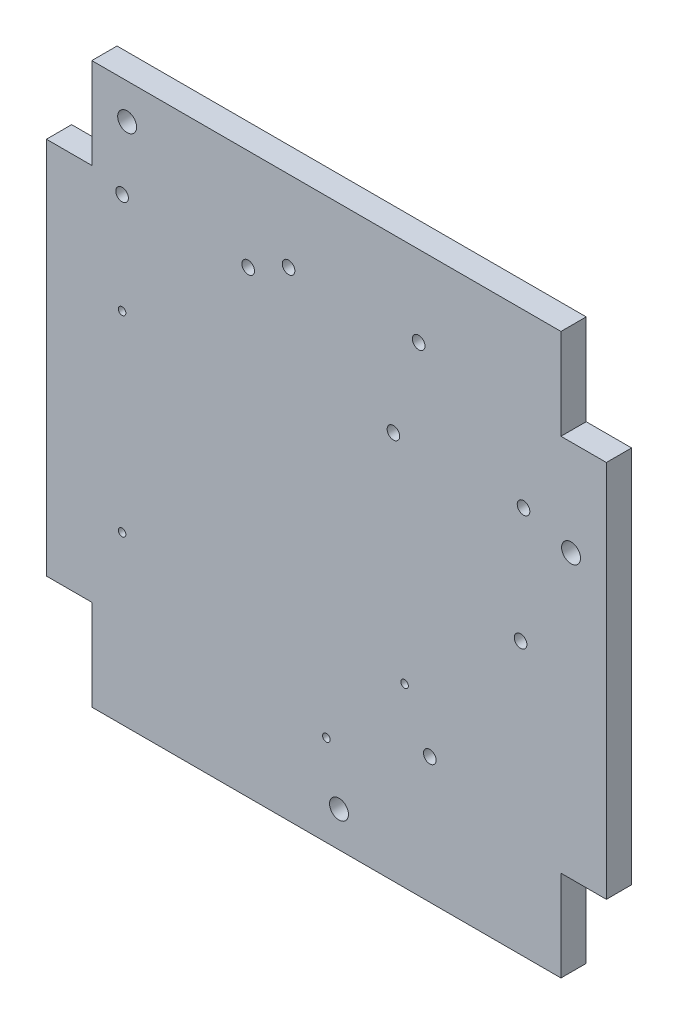
ISO-10303-21;
HEADER;
FILE_DESCRIPTION(('STEP AP214'),'2;1');
FILE_NAME('part.step','',(''),(''),'','','');
FILE_SCHEMA(('AUTOMOTIVE_DESIGN { 1 0 10303 214 1 1 1 1 }'));
ENDSEC;
DATA;
#1=APPLICATION_CONTEXT('core data for automotive mechanical design processes');
#2=APPLICATION_PROTOCOL_DEFINITION('international standard','automotive_design',2000,#1);
#3=PRODUCT_CONTEXT('',#1,'mechanical');
#4=PRODUCT('Part','Part','',(#3));
#5=PRODUCT_RELATED_PRODUCT_CATEGORY('part','',(#4));
#6=PRODUCT_DEFINITION_FORMATION('','',#4);
#7=PRODUCT_DEFINITION_CONTEXT('part definition',#1,'design');
#8=PRODUCT_DEFINITION('design','',#6,#7);
#9=PRODUCT_DEFINITION_SHAPE('','',#8);
#10=(LENGTH_UNIT() NAMED_UNIT(*) SI_UNIT(.MILLI.,.METRE.));
#11=(NAMED_UNIT(*) PLANE_ANGLE_UNIT() SI_UNIT($,.RADIAN.));
#12=(NAMED_UNIT(*) SI_UNIT($,.STERADIAN.) SOLID_ANGLE_UNIT());
#13=UNCERTAINTY_MEASURE_WITH_UNIT(LENGTH_MEASURE(1.E-05),#10,'distance_accuracy_value','');
#14=(GEOMETRIC_REPRESENTATION_CONTEXT(3) GLOBAL_UNCERTAINTY_ASSIGNED_CONTEXT((#13)) GLOBAL_UNIT_ASSIGNED_CONTEXT((#10,
#11,#12)) REPRESENTATION_CONTEXT('',''));
#15=CARTESIAN_POINT('',(0.,0.,0.));
#16=DIRECTION('',(0.,0.,1.));
#17=DIRECTION('',(1.,0.,0.));
#18=AXIS2_PLACEMENT_3D('',#15,#16,#17);
#19=CARTESIAN_POINT('',(0.,18.,5.));
#20=DIRECTION('',(0.,1.,0.));
#21=DIRECTION('',(0.,0.,1.));
#22=AXIS2_PLACEMENT_3D('',#19,#20,#21);
#23=PLANE('',#22);
#24=DIRECTION('',(1.,0.,0.));
#25=VECTOR('',#24,1.);
#26=CARTESIAN_POINT('',(0.,18.,0.));
#27=LINE('',#26,#25);
#28=CARTESIAN_POINT('',(0.,18.,0.));
#29=VERTEX_POINT('',#28);
#30=CARTESIAN_POINT('',(8.99999999999999,18.,0.));
#31=VERTEX_POINT('',#30);
#32=EDGE_CURVE('E209',#29,#31,#27,.T.);
#33=ORIENTED_EDGE('',*,*,#32,.T.);
#34=DIRECTION('',(0.,0.,-1.));
#35=VECTOR('',#34,1.);
#36=CARTESIAN_POINT('',(8.99999999999999,18.,5.));
#37=LINE('',#36,#35);
#38=CARTESIAN_POINT('',(8.99999999999999,18.,5.));
#39=VERTEX_POINT('',#38);
#40=EDGE_CURVE('E11',#39,#31,#37,.T.);
#41=ORIENTED_EDGE('',*,*,#40,.F.);
#42=DIRECTION('',(1.,0.,0.));
#43=VECTOR('',#42,1.);
#44=CARTESIAN_POINT('',(0.,18.,5.));
#45=LINE('',#44,#43);
#46=CARTESIAN_POINT('',(0.,18.,5.));
#47=VERTEX_POINT('',#46);
#48=EDGE_CURVE('E716',#47,#39,#45,.T.);
#49=ORIENTED_EDGE('',*,*,#48,.F.);
#50=DIRECTION('',(0.,0.,-1.));
#51=VECTOR('',#50,1.);
#52=CARTESIAN_POINT('',(0.,18.,5.));
#53=LINE('',#52,#51);
#54=EDGE_CURVE('E60',#47,#29,#53,.T.);
#55=ORIENTED_EDGE('',*,*,#54,.T.);
#56=EDGE_LOOP('',(#33,#41,#49,#55));
#57=FACE_BOUND('',#56,.T.);
#58=ADVANCED_FACE('F43',(#57),#23,.F.);
#59=CARTESIAN_POINT('',(9.,0.,5.));
#60=DIRECTION('',(1.,0.,0.));
#61=DIRECTION('',(0.,1.,0.));
#62=AXIS2_PLACEMENT_3D('',#59,#60,#61);
#63=PLANE('',#62);
#64=DIRECTION('',(0.,-1.,0.));
#65=VECTOR('',#64,1.);
#66=CARTESIAN_POINT('',(9.,0.,0.));
#67=LINE('',#66,#65);
#68=CARTESIAN_POINT('',(9.,0.,0.));
#69=VERTEX_POINT('',#68);
#70=EDGE_CURVE('E211',#31,#69,#67,.T.);
#71=ORIENTED_EDGE('',*,*,#70,.T.);
#72=DIRECTION('',(0.,0.,-1.));
#73=VECTOR('',#72,1.);
#74=CARTESIAN_POINT('',(9.,0.,5.));
#75=LINE('',#74,#73);
#76=CARTESIAN_POINT('',(9.,0.,5.));
#77=VERTEX_POINT('',#76);
#78=EDGE_CURVE('E52',#77,#69,#75,.T.);
#79=ORIENTED_EDGE('',*,*,#78,.F.);
#80=DIRECTION('',(0.,-1.,0.));
#81=VECTOR('',#80,1.);
#82=CARTESIAN_POINT('',(9.,0.,5.));
#83=LINE('',#82,#81);
#84=EDGE_CURVE('E110',#39,#77,#83,.T.);
#85=ORIENTED_EDGE('',*,*,#84,.F.);
#86=ORIENTED_EDGE('',*,*,#40,.T.);
#87=EDGE_LOOP('',(#71,#79,#85,#86));
#88=FACE_BOUND('',#87,.T.);
#89=ADVANCED_FACE('F304',(#88),#63,.F.);
#90=CARTESIAN_POINT('',(0.,0.,5.));
#91=DIRECTION('',(0.,1.,0.));
#92=DIRECTION('',(-1.,0.,0.));
#93=AXIS2_PLACEMENT_3D('',#90,#91,#92);
#94=PLANE('',#93);
#95=DIRECTION('',(1.,0.,0.));
#96=VECTOR('',#95,1.);
#97=CARTESIAN_POINT('',(0.,0.,0.));
#98=LINE('',#97,#96);
#99=CARTESIAN_POINT('',(102.,0.,0.));
#100=VERTEX_POINT('',#99);
#101=EDGE_CURVE('E213',#69,#100,#98,.T.);
#102=ORIENTED_EDGE('',*,*,#101,.T.);
#103=DIRECTION('',(0.,0.,-1.));
#104=VECTOR('',#103,1.);
#105=CARTESIAN_POINT('',(102.,0.,5.));
#106=LINE('',#105,#104);
#107=CARTESIAN_POINT('',(102.,0.,5.));
#108=VERTEX_POINT('',#107);
#109=EDGE_CURVE('E254',#108,#100,#106,.T.);
#110=ORIENTED_EDGE('',*,*,#109,.F.);
#111=DIRECTION('',(1.,0.,0.));
#112=VECTOR('',#111,1.);
#113=CARTESIAN_POINT('',(0.,0.,5.));
#114=LINE('',#113,#112);
#115=EDGE_CURVE('E261',#77,#108,#114,.T.);
#116=ORIENTED_EDGE('',*,*,#115,.F.);
#117=ORIENTED_EDGE('',*,*,#78,.T.);
#118=EDGE_LOOP('',(#102,#110,#116,#117));
#119=FACE_BOUND('',#118,.T.);
#120=ADVANCED_FACE('F259',(#119),#94,.F.);
#121=CARTESIAN_POINT('',(102.,-1.5728159515523E-13,5.));
#122=DIRECTION('',(1.,0.,0.));
#123=DIRECTION('',(0.,1.,0.));
#124=AXIS2_PLACEMENT_3D('',#121,#122,#123);
#125=PLANE('',#124);
#126=DIRECTION('',(0.,-1.,0.));
#127=VECTOR('',#126,1.);
#128=CARTESIAN_POINT('',(102.,-1.5728159515523E-13,0.));
#129=LINE('',#128,#127);
#130=CARTESIAN_POINT('',(102.,18.,0.));
#131=VERTEX_POINT('',#130);
#132=EDGE_CURVE('E216',#131,#100,#129,.T.);
#133=ORIENTED_EDGE('',*,*,#132,.F.);
#134=DIRECTION('',(0.,0.,-1.));
#135=VECTOR('',#134,1.);
#136=CARTESIAN_POINT('',(102.,18.,5.));
#137=LINE('',#136,#135);
#138=CARTESIAN_POINT('',(102.,18.,5.));
#139=VERTEX_POINT('',#138);
#140=EDGE_CURVE('E252',#139,#131,#137,.T.);
#141=ORIENTED_EDGE('',*,*,#140,.F.);
#142=DIRECTION('',(0.,-1.,0.));
#143=VECTOR('',#142,1.);
#144=CARTESIAN_POINT('',(102.,-1.5728159515523E-13,5.));
#145=LINE('',#144,#143);
#146=EDGE_CURVE('E272',#139,#108,#145,.T.);
#147=ORIENTED_EDGE('',*,*,#146,.T.);
#148=ORIENTED_EDGE('',*,*,#109,.T.);
#149=EDGE_LOOP('',(#133,#141,#147,#148));
#150=FACE_BOUND('',#149,.T.);
#151=ADVANCED_FACE('F268',(#150),#125,.T.);
#152=CARTESIAN_POINT('',(0.,18.,5.));
#153=DIRECTION('',(0.,1.,0.));
#154=DIRECTION('',(0.,0.,1.));
#155=AXIS2_PLACEMENT_3D('',#152,#153,#154);
#156=PLANE('',#155);
#157=DIRECTION('',(1.,0.,0.));
#158=VECTOR('',#157,1.);
#159=CARTESIAN_POINT('',(0.,18.,0.));
#160=LINE('',#159,#158);
#161=CARTESIAN_POINT('',(111.,18.,0.));
#162=VERTEX_POINT('',#161);
#163=EDGE_CURVE('E219',#131,#162,#160,.T.);
#164=ORIENTED_EDGE('',*,*,#163,.T.);
#165=DIRECTION('',(0.,0.,-1.));
#166=VECTOR('',#165,1.);
#167=CARTESIAN_POINT('',(111.,18.,5.));
#168=LINE('',#167,#166);
#169=CARTESIAN_POINT('',(111.,18.,5.));
#170=VERTEX_POINT('',#169);
#171=EDGE_CURVE('E249',#170,#162,#168,.T.);
#172=ORIENTED_EDGE('',*,*,#171,.F.);
#173=DIRECTION('',(1.,0.,0.));
#174=VECTOR('',#173,1.);
#175=CARTESIAN_POINT('',(0.,18.,5.));
#176=LINE('',#175,#174);
#177=EDGE_CURVE('E273',#139,#170,#176,.T.);
#178=ORIENTED_EDGE('',*,*,#177,.F.);
#179=ORIENTED_EDGE('',*,*,#140,.T.);
#180=EDGE_LOOP('',(#164,#172,#178,#179));
#181=FACE_BOUND('',#180,.T.);
#182=ADVANCED_FACE('F589',(#181),#156,.F.);
#183=CARTESIAN_POINT('',(111.,0.,5.));
#184=DIRECTION('',(-1.,0.,0.));
#185=DIRECTION('',(0.,-1.,0.));
#186=AXIS2_PLACEMENT_3D('',#183,#184,#185);
#187=PLANE('',#186);
#188=DIRECTION('',(0.,1.,0.));
#189=VECTOR('',#188,1.);
#190=CARTESIAN_POINT('',(111.,0.,0.));
#191=LINE('',#190,#189);
#192=CARTESIAN_POINT('',(111.,93.,0.));
#193=VERTEX_POINT('',#192);
#194=EDGE_CURVE('E221',#162,#193,#191,.T.);
#195=ORIENTED_EDGE('',*,*,#194,.T.);
#196=DIRECTION('',(0.,0.,-1.));
#197=VECTOR('',#196,1.);
#198=CARTESIAN_POINT('',(111.,93.,5.));
#199=LINE('',#198,#197);
#200=CARTESIAN_POINT('',(111.,93.,5.));
#201=VERTEX_POINT('',#200);
#202=EDGE_CURVE('E247',#201,#193,#199,.T.);
#203=ORIENTED_EDGE('',*,*,#202,.F.);
#204=DIRECTION('',(0.,1.,0.));
#205=VECTOR('',#204,1.);
#206=CARTESIAN_POINT('',(111.,0.,5.));
#207=LINE('',#206,#205);
#208=EDGE_CURVE('E275',#170,#201,#207,.T.);
#209=ORIENTED_EDGE('',*,*,#208,.F.);
#210=ORIENTED_EDGE('',*,*,#171,.T.);
#211=EDGE_LOOP('',(#195,#203,#209,#210));
#212=FACE_BOUND('',#211,.T.);
#213=ADVANCED_FACE('F578',(#212),#187,.F.);
#214=CARTESIAN_POINT('',(0.,93.,5.));
#215=DIRECTION('',(0.,1.,0.));
#216=DIRECTION('',(0.,0.,1.));
#217=AXIS2_PLACEMENT_3D('',#214,#215,#216);
#218=PLANE('',#217);
#219=DIRECTION('',(1.,0.,0.));
#220=VECTOR('',#219,1.);
#221=CARTESIAN_POINT('',(0.,93.,0.));
#222=LINE('',#221,#220);
#223=CARTESIAN_POINT('',(102.,93.,0.));
#224=VERTEX_POINT('',#223);
#225=EDGE_CURVE('E224',#224,#193,#222,.T.);
#226=ORIENTED_EDGE('',*,*,#225,.F.);
#227=DIRECTION('',(0.,0.,-1.));
#228=VECTOR('',#227,1.);
#229=CARTESIAN_POINT('',(102.,93.,5.));
#230=LINE('',#229,#228);
#231=CARTESIAN_POINT('',(102.,93.,5.));
#232=VERTEX_POINT('',#231);
#233=EDGE_CURVE('E245',#232,#224,#230,.T.);
#234=ORIENTED_EDGE('',*,*,#233,.F.);
#235=DIRECTION('',(1.,0.,0.));
#236=VECTOR('',#235,1.);
#237=CARTESIAN_POINT('',(0.,93.,5.));
#238=LINE('',#237,#236);
#239=EDGE_CURVE('E281',#232,#201,#238,.T.);
#240=ORIENTED_EDGE('',*,*,#239,.T.);
#241=ORIENTED_EDGE('',*,*,#202,.T.);
#242=EDGE_LOOP('',(#226,#234,#240,#241));
#243=FACE_BOUND('',#242,.T.);
#244=ADVANCED_FACE('F567',(#243),#218,.T.);
#245=CARTESIAN_POINT('',(102.,0.,5.));
#246=DIRECTION('',(-1.,0.,0.));
#247=DIRECTION('',(0.,-1.,0.));
#248=AXIS2_PLACEMENT_3D('',#245,#246,#247);
#249=PLANE('',#248);
#250=DIRECTION('',(0.,1.,0.));
#251=VECTOR('',#250,1.);
#252=CARTESIAN_POINT('',(102.,0.,0.));
#253=LINE('',#252,#251);
#254=CARTESIAN_POINT('',(102.,111.,0.));
#255=VERTEX_POINT('',#254);
#256=EDGE_CURVE('E227',#224,#255,#253,.T.);
#257=ORIENTED_EDGE('',*,*,#256,.T.);
#258=DIRECTION('',(0.,0.,-1.));
#259=VECTOR('',#258,1.);
#260=CARTESIAN_POINT('',(102.,111.,5.));
#261=LINE('',#260,#259);
#262=CARTESIAN_POINT('',(102.,111.,5.));
#263=VERTEX_POINT('',#262);
#264=EDGE_CURVE('E243',#263,#255,#261,.T.);
#265=ORIENTED_EDGE('',*,*,#264,.F.);
#266=DIRECTION('',(0.,1.,0.));
#267=VECTOR('',#266,1.);
#268=CARTESIAN_POINT('',(102.,0.,5.));
#269=LINE('',#268,#267);
#270=EDGE_CURVE('E284',#232,#263,#269,.T.);
#271=ORIENTED_EDGE('',*,*,#270,.F.);
#272=ORIENTED_EDGE('',*,*,#233,.T.);
#273=EDGE_LOOP('',(#257,#265,#271,#272));
#274=FACE_BOUND('',#273,.T.);
#275=ADVANCED_FACE('F557',(#274),#249,.F.);
#276=CARTESIAN_POINT('',(0.,111.,5.));
#277=DIRECTION('',(0.,1.,0.));
#278=DIRECTION('',(0.,0.,1.));
#279=AXIS2_PLACEMENT_3D('',#276,#277,#278);
#280=PLANE('',#279);
#281=DIRECTION('',(1.,0.,0.));
#282=VECTOR('',#281,1.);
#283=CARTESIAN_POINT('',(0.,111.,0.));
#284=LINE('',#283,#282);
#285=CARTESIAN_POINT('',(8.99999999999997,111.,0.));
#286=VERTEX_POINT('',#285);
#287=EDGE_CURVE('E230',#286,#255,#284,.T.);
#288=ORIENTED_EDGE('',*,*,#287,.F.);
#289=DIRECTION('',(0.,0.,-1.));
#290=VECTOR('',#289,1.);
#291=CARTESIAN_POINT('',(8.99999999999997,111.,5.));
#292=LINE('',#291,#290);
#293=CARTESIAN_POINT('',(8.99999999999997,111.,5.));
#294=VERTEX_POINT('',#293);
#295=EDGE_CURVE('E147',#294,#286,#292,.T.);
#296=ORIENTED_EDGE('',*,*,#295,.F.);
#297=DIRECTION('',(1.,0.,0.));
#298=VECTOR('',#297,1.);
#299=CARTESIAN_POINT('',(0.,111.,5.));
#300=LINE('',#299,#298);
#301=EDGE_CURVE('E156',#294,#263,#300,.T.);
#302=ORIENTED_EDGE('',*,*,#301,.T.);
#303=ORIENTED_EDGE('',*,*,#264,.T.);
#304=EDGE_LOOP('',(#288,#296,#302,#303));
#305=FACE_BOUND('',#304,.T.);
#306=ADVANCED_FACE('F287',(#305),#280,.T.);
#307=CARTESIAN_POINT('',(8.99999999999999,0.,5.));
#308=DIRECTION('',(-1.,0.,0.));
#309=DIRECTION('',(0.,-1.,0.));
#310=AXIS2_PLACEMENT_3D('',#307,#308,#309);
#311=PLANE('',#310);
#312=DIRECTION('',(0.,1.,0.));
#313=VECTOR('',#312,1.);
#314=CARTESIAN_POINT('',(8.99999999999999,0.,0.));
#315=LINE('',#314,#313);
#316=CARTESIAN_POINT('',(8.99999999999998,93.,0.));
#317=VERTEX_POINT('',#316);
#318=EDGE_CURVE('E143',#317,#286,#315,.T.);
#319=ORIENTED_EDGE('',*,*,#318,.F.);
#320=DIRECTION('',(0.,0.,-1.));
#321=VECTOR('',#320,1.);
#322=CARTESIAN_POINT('',(8.99999999999998,93.,5.));
#323=LINE('',#322,#321);
#324=CARTESIAN_POINT('',(8.99999999999998,93.,5.));
#325=VERTEX_POINT('',#324);
#326=EDGE_CURVE('E138',#325,#317,#323,.T.);
#327=ORIENTED_EDGE('',*,*,#326,.F.);
#328=DIRECTION('',(0.,1.,0.));
#329=VECTOR('',#328,1.);
#330=CARTESIAN_POINT('',(8.99999999999999,0.,5.));
#331=LINE('',#330,#329);
#332=EDGE_CURVE('E141',#325,#294,#331,.T.);
#333=ORIENTED_EDGE('',*,*,#332,.T.);
#334=ORIENTED_EDGE('',*,*,#295,.T.);
#335=EDGE_LOOP('',(#319,#327,#333,#334));
#336=FACE_BOUND('',#335,.T.);
#337=ADVANCED_FACE('F140',(#336),#311,.T.);
#338=CARTESIAN_POINT('',(0.,93.,5.));
#339=DIRECTION('',(0.,1.,0.));
#340=DIRECTION('',(0.,0.,1.));
#341=AXIS2_PLACEMENT_3D('',#338,#339,#340);
#342=PLANE('',#341);
#343=DIRECTION('',(1.,0.,0.));
#344=VECTOR('',#343,1.);
#345=CARTESIAN_POINT('',(0.,93.,0.));
#346=LINE('',#345,#344);
#347=CARTESIAN_POINT('',(0.,93.,0.));
#348=VERTEX_POINT('',#347);
#349=EDGE_CURVE('E234',#348,#317,#346,.T.);
#350=ORIENTED_EDGE('',*,*,#349,.F.);
#351=DIRECTION('',(0.,0.,-1.));
#352=VECTOR('',#351,1.);
#353=CARTESIAN_POINT('',(0.,93.,5.));
#354=LINE('',#353,#352);
#355=CARTESIAN_POINT('',(0.,93.,5.));
#356=VERTEX_POINT('',#355);
#357=EDGE_CURVE('E98',#356,#348,#354,.T.);
#358=ORIENTED_EDGE('',*,*,#357,.F.);
#359=DIRECTION('',(1.,0.,0.));
#360=VECTOR('',#359,1.);
#361=CARTESIAN_POINT('',(0.,93.,5.));
#362=LINE('',#361,#360);
#363=EDGE_CURVE('E154',#356,#325,#362,.T.);
#364=ORIENTED_EDGE('',*,*,#363,.T.);
#365=ORIENTED_EDGE('',*,*,#326,.T.);
#366=EDGE_LOOP('',(#350,#358,#364,#365));
#367=FACE_BOUND('',#366,.T.);
#368=ADVANCED_FACE('F158',(#367),#342,.T.);
#369=CARTESIAN_POINT('',(15.,91.,5.));
#370=DIRECTION('',(0.,0.,-1.));
#371=DIRECTION('',(-1.,0.,0.));
#372=AXIS2_PLACEMENT_3D('',#369,#370,#371);
#373=CYLINDRICAL_SURFACE('',#372,1.25);
#374=CARTESIAN_POINT('',(15.,91.,5.));
#375=DIRECTION('',(0.,0.,1.));
#376=DIRECTION('',(1.,0.,0.));
#377=AXIS2_PLACEMENT_3D('',#374,#375,#376);
#378=CIRCLE('',#377,1.25);
#379=CARTESIAN_POINT('',(16.25,91.,5.));
#380=VERTEX_POINT('',#379);
#381=EDGE_CURVE('E713',#380,#380,#378,.T.);
#382=ORIENTED_EDGE('',*,*,#381,.T.);
#383=EDGE_LOOP('',(#382));
#384=FACE_BOUND('',#383,.T.);
#385=CARTESIAN_POINT('',(15.,91.,0.));
#386=DIRECTION('',(0.,0.,1.));
#387=DIRECTION('',(1.,0.,0.));
#388=AXIS2_PLACEMENT_3D('',#385,#386,#387);
#389=CIRCLE('',#388,1.25);
#390=CARTESIAN_POINT('',(16.25,91.,0.));
#391=VERTEX_POINT('',#390);
#392=EDGE_CURVE('E206',#391,#391,#389,.T.);
#393=ORIENTED_EDGE('',*,*,#392,.F.);
#394=EDGE_LOOP('',(#393));
#395=FACE_BOUND('',#394,.T.);
#396=ADVANCED_FACE('F312',(#384,#395),#373,.F.);
#397=CARTESIAN_POINT('',(40.,91.,5.));
#398=DIRECTION('',(0.,0.,-1.));
#399=DIRECTION('',(-1.,0.,0.));
#400=AXIS2_PLACEMENT_3D('',#397,#398,#399);
#401=CYLINDRICAL_SURFACE('',#400,1.25);
#402=CARTESIAN_POINT('',(40.,91.,5.));
#403=DIRECTION('',(0.,0.,1.));
#404=DIRECTION('',(1.,0.,0.));
#405=AXIS2_PLACEMENT_3D('',#402,#403,#404);
#406=CIRCLE('',#405,1.25);
#407=CARTESIAN_POINT('',(41.25,91.,5.));
#408=VERTEX_POINT('',#407);
#409=EDGE_CURVE('E710',#408,#408,#406,.T.);
#410=ORIENTED_EDGE('',*,*,#409,.T.);
#411=EDGE_LOOP('',(#410));
#412=FACE_BOUND('',#411,.T.);
#413=CARTESIAN_POINT('',(40.,91.,0.));
#414=DIRECTION('',(0.,0.,1.));
#415=DIRECTION('',(1.,0.,0.));
#416=AXIS2_PLACEMENT_3D('',#413,#414,#415);
#417=CIRCLE('',#416,1.25);
#418=CARTESIAN_POINT('',(41.25,91.,0.));
#419=VERTEX_POINT('',#418);
#420=EDGE_CURVE('E203',#419,#419,#417,.T.);
#421=ORIENTED_EDGE('',*,*,#420,.F.);
#422=EDGE_LOOP('',(#421));
#423=FACE_BOUND('',#422,.T.);
#424=ADVANCED_FACE('F315',(#412,#423),#401,.F.);
#425=CARTESIAN_POINT('',(48.,95.,5.));
#426=DIRECTION('',(0.,0.,-1.));
#427=DIRECTION('',(-1.,0.,0.));
#428=AXIS2_PLACEMENT_3D('',#425,#426,#427);
#429=CYLINDRICAL_SURFACE('',#428,1.25);
#430=CARTESIAN_POINT('',(48.,95.,5.));
#431=DIRECTION('',(0.,0.,1.));
#432=DIRECTION('',(1.,0.,0.));
#433=AXIS2_PLACEMENT_3D('',#430,#431,#432);
#434=CIRCLE('',#433,1.25);
#435=CARTESIAN_POINT('',(49.25,95.,5.));
#436=VERTEX_POINT('',#435);
#437=EDGE_CURVE('E707',#436,#436,#434,.T.);
#438=ORIENTED_EDGE('',*,*,#437,.T.);
#439=EDGE_LOOP('',(#438));
#440=FACE_BOUND('',#439,.T.);
#441=CARTESIAN_POINT('',(48.,95.,0.));
#442=DIRECTION('',(0.,0.,1.));
#443=DIRECTION('',(1.,0.,0.));
#444=AXIS2_PLACEMENT_3D('',#441,#442,#443);
#445=CIRCLE('',#444,1.25);
#446=CARTESIAN_POINT('',(49.25,95.,0.));
#447=VERTEX_POINT('',#446);
#448=EDGE_CURVE('E200',#447,#447,#445,.T.);
#449=ORIENTED_EDGE('',*,*,#448,.F.);
#450=EDGE_LOOP('',(#449));
#451=FACE_BOUND('',#450,.T.);
#452=ADVANCED_FACE('F319',(#440,#451),#429,.F.);
#453=CARTESIAN_POINT('',(68.7906228862918,77.,5.));
#454=DIRECTION('',(0.,0.,-1.));
#455=DIRECTION('',(-1.,0.,0.));
#456=AXIS2_PLACEMENT_3D('',#453,#454,#455);
#457=CYLINDRICAL_SURFACE('',#456,1.25);
#458=CARTESIAN_POINT('',(68.7906228862918,77.,5.));
#459=DIRECTION('',(0.,0.,1.));
#460=DIRECTION('',(1.,0.,0.));
#461=AXIS2_PLACEMENT_3D('',#458,#459,#460);
#462=CIRCLE('',#461,1.25);
#463=CARTESIAN_POINT('',(70.0406228862918,77.,5.));
#464=VERTEX_POINT('',#463);
#465=EDGE_CURVE('E704',#464,#464,#462,.T.);
#466=ORIENTED_EDGE('',*,*,#465,.T.);
#467=EDGE_LOOP('',(#466));
#468=FACE_BOUND('',#467,.T.);
#469=CARTESIAN_POINT('',(68.7906228862918,77.,0.));
#470=DIRECTION('',(0.,0.,1.));
#471=DIRECTION('',(1.,0.,0.));
#472=AXIS2_PLACEMENT_3D('',#469,#470,#471);
#473=CIRCLE('',#472,1.25);
#474=CARTESIAN_POINT('',(70.0406228862918,77.,0.));
#475=VERTEX_POINT('',#474);
#476=EDGE_CURVE('E197',#475,#475,#473,.T.);
#477=ORIENTED_EDGE('',*,*,#476,.F.);
#478=EDGE_LOOP('',(#477));
#479=FACE_BOUND('',#478,.T.);
#480=ADVANCED_FACE('F323',(#468,#479),#457,.F.);
#481=CARTESIAN_POINT('',(73.7906228862918,95.,5.));
#482=DIRECTION('',(0.,0.,-1.));
#483=DIRECTION('',(-1.,0.,0.));
#484=AXIS2_PLACEMENT_3D('',#481,#482,#483);
#485=CYLINDRICAL_SURFACE('',#484,1.25);
#486=CARTESIAN_POINT('',(73.7906228862918,95.,5.));
#487=DIRECTION('',(0.,0.,1.));
#488=DIRECTION('',(1.,0.,0.));
#489=AXIS2_PLACEMENT_3D('',#486,#487,#488);
#490=CIRCLE('',#489,1.25);
#491=CARTESIAN_POINT('',(75.0406228862918,95.,5.));
#492=VERTEX_POINT('',#491);
#493=EDGE_CURVE('E701',#492,#492,#490,.T.);
#494=ORIENTED_EDGE('',*,*,#493,.T.);
#495=EDGE_LOOP('',(#494));
#496=FACE_BOUND('',#495,.T.);
#497=CARTESIAN_POINT('',(73.7906228862918,95.,0.));
#498=DIRECTION('',(0.,0.,1.));
#499=DIRECTION('',(1.,0.,0.));
#500=AXIS2_PLACEMENT_3D('',#497,#498,#499);
#501=CIRCLE('',#500,1.25);
#502=CARTESIAN_POINT('',(75.0406228862918,95.,0.));
#503=VERTEX_POINT('',#502);
#504=EDGE_CURVE('E194',#503,#503,#501,.T.);
#505=ORIENTED_EDGE('',*,*,#504,.F.);
#506=EDGE_LOOP('',(#505));
#507=FACE_BOUND('',#506,.T.);
#508=ADVANCED_FACE('F327',(#496,#507),#485,.F.);
#509=CARTESIAN_POINT('',(94.5812457725836,77.,5.));
#510=DIRECTION('',(0.,0.,-1.));
#511=DIRECTION('',(-1.,0.,0.));
#512=AXIS2_PLACEMENT_3D('',#509,#510,#511);
#513=CYLINDRICAL_SURFACE('',#512,1.25);
#514=CARTESIAN_POINT('',(94.5812457725836,77.,5.));
#515=DIRECTION('',(0.,0.,1.));
#516=DIRECTION('',(1.,0.,0.));
#517=AXIS2_PLACEMENT_3D('',#514,#515,#516);
#518=CIRCLE('',#517,1.25);
#519=CARTESIAN_POINT('',(95.8312457725836,77.,5.));
#520=VERTEX_POINT('',#519);
#521=EDGE_CURVE('E698',#520,#520,#518,.T.);
#522=ORIENTED_EDGE('',*,*,#521,.T.);
#523=EDGE_LOOP('',(#522));
#524=FACE_BOUND('',#523,.T.);
#525=CARTESIAN_POINT('',(94.5812457725836,77.,0.));
#526=DIRECTION('',(0.,0.,1.));
#527=DIRECTION('',(1.,0.,0.));
#528=AXIS2_PLACEMENT_3D('',#525,#526,#527);
#529=CIRCLE('',#528,1.25);
#530=CARTESIAN_POINT('',(95.8312457725836,77.,0.));
#531=VERTEX_POINT('',#530);
#532=EDGE_CURVE('E191',#531,#531,#529,.T.);
#533=ORIENTED_EDGE('',*,*,#532,.F.);
#534=EDGE_LOOP('',(#533));
#535=FACE_BOUND('',#534,.T.);
#536=ADVANCED_FACE('F331',(#524,#535),#513,.F.);
#537=CARTESIAN_POINT('',(15.,71.,5.));
#538=DIRECTION('',(0.,0.,-1.));
#539=DIRECTION('',(-1.,0.,0.));
#540=AXIS2_PLACEMENT_3D('',#537,#538,#539);
#541=CYLINDRICAL_SURFACE('',#540,0.750000000000002);
#542=CARTESIAN_POINT('',(15.,71.,5.));
#543=DIRECTION('',(0.,0.,1.));
#544=DIRECTION('',(1.,0.,0.));
#545=AXIS2_PLACEMENT_3D('',#542,#543,#544);
#546=CIRCLE('',#545,0.750000000000002);
#547=CARTESIAN_POINT('',(15.75,71.,5.));
#548=VERTEX_POINT('',#547);
#549=EDGE_CURVE('E695',#548,#548,#546,.T.);
#550=ORIENTED_EDGE('',*,*,#549,.T.);
#551=EDGE_LOOP('',(#550));
#552=FACE_BOUND('',#551,.T.);
#553=CARTESIAN_POINT('',(15.,71.,0.));
#554=DIRECTION('',(0.,0.,1.));
#555=DIRECTION('',(1.,0.,0.));
#556=AXIS2_PLACEMENT_3D('',#553,#554,#555);
#557=CIRCLE('',#556,0.750000000000002);
#558=CARTESIAN_POINT('',(15.75,71.,0.));
#559=VERTEX_POINT('',#558);
#560=EDGE_CURVE('E188',#559,#559,#557,.T.);
#561=ORIENTED_EDGE('',*,*,#560,.F.);
#562=EDGE_LOOP('',(#561));
#563=FACE_BOUND('',#562,.T.);
#564=ADVANCED_FACE('F335',(#552,#563),#541,.F.);
#565=CARTESIAN_POINT('',(71.,35.,5.));
#566=DIRECTION('',(0.,0.,-1.));
#567=DIRECTION('',(-1.,0.,0.));
#568=AXIS2_PLACEMENT_3D('',#565,#566,#567);
#569=CYLINDRICAL_SURFACE('',#568,0.749999999999999);
#570=CARTESIAN_POINT('',(71.,35.,5.));
#571=DIRECTION('',(0.,0.,1.));
#572=DIRECTION('',(1.,0.,0.));
#573=AXIS2_PLACEMENT_3D('',#570,#571,#572);
#574=CIRCLE('',#573,0.749999999999999);
#575=CARTESIAN_POINT('',(71.75,35.,5.));
#576=VERTEX_POINT('',#575);
#577=EDGE_CURVE('E692',#576,#576,#574,.T.);
#578=ORIENTED_EDGE('',*,*,#577,.T.);
#579=EDGE_LOOP('',(#578));
#580=FACE_BOUND('',#579,.T.);
#581=CARTESIAN_POINT('',(71.,35.,0.));
#582=DIRECTION('',(0.,0.,1.));
#583=DIRECTION('',(1.,0.,0.));
#584=AXIS2_PLACEMENT_3D('',#581,#582,#583);
#585=CIRCLE('',#584,0.749999999999999);
#586=CARTESIAN_POINT('',(71.75,35.,0.));
#587=VERTEX_POINT('',#586);
#588=EDGE_CURVE('E185',#587,#587,#585,.T.);
#589=ORIENTED_EDGE('',*,*,#588,.F.);
#590=EDGE_LOOP('',(#589));
#591=FACE_BOUND('',#590,.T.);
#592=ADVANCED_FACE('F339',(#580,#591),#569,.F.);
#593=CARTESIAN_POINT('',(15.,33.,5.));
#594=DIRECTION('',(0.,0.,-1.));
#595=DIRECTION('',(-1.,0.,0.));
#596=AXIS2_PLACEMENT_3D('',#593,#594,#595);
#597=CYLINDRICAL_SURFACE('',#596,0.750000000000002);
#598=CARTESIAN_POINT('',(15.,33.,5.));
#599=DIRECTION('',(0.,0.,1.));
#600=DIRECTION('',(1.,0.,0.));
#601=AXIS2_PLACEMENT_3D('',#598,#599,#600);
#602=CIRCLE('',#601,0.750000000000002);
#603=CARTESIAN_POINT('',(15.75,33.,5.));
#604=VERTEX_POINT('',#603);
#605=EDGE_CURVE('E689',#604,#604,#602,.T.);
#606=ORIENTED_EDGE('',*,*,#605,.T.);
#607=EDGE_LOOP('',(#606));
#608=FACE_BOUND('',#607,.T.);
#609=CARTESIAN_POINT('',(15.,33.,0.));
#610=DIRECTION('',(0.,0.,1.));
#611=DIRECTION('',(1.,0.,0.));
#612=AXIS2_PLACEMENT_3D('',#609,#610,#611);
#613=CIRCLE('',#612,0.750000000000002);
#614=CARTESIAN_POINT('',(15.75,33.,0.));
#615=VERTEX_POINT('',#614);
#616=EDGE_CURVE('E182',#615,#615,#613,.T.);
#617=ORIENTED_EDGE('',*,*,#616,.F.);
#618=EDGE_LOOP('',(#617));
#619=FACE_BOUND('',#618,.T.);
#620=ADVANCED_FACE('F343',(#608,#619),#597,.F.);
#621=CARTESIAN_POINT('',(55.5,18.,5.));
#622=DIRECTION('',(0.,0.,-1.));
#623=DIRECTION('',(-1.,0.,0.));
#624=AXIS2_PLACEMENT_3D('',#621,#622,#623);
#625=CYLINDRICAL_SURFACE('',#624,0.749999999999999);
#626=CARTESIAN_POINT('',(55.5,18.,5.));
#627=DIRECTION('',(0.,0.,1.));
#628=DIRECTION('',(1.,0.,0.));
#629=AXIS2_PLACEMENT_3D('',#626,#627,#628);
#630=CIRCLE('',#629,0.749999999999999);
#631=CARTESIAN_POINT('',(56.25,18.,5.));
#632=VERTEX_POINT('',#631);
#633=EDGE_CURVE('E686',#632,#632,#630,.T.);
#634=ORIENTED_EDGE('',*,*,#633,.T.);
#635=EDGE_LOOP('',(#634));
#636=FACE_BOUND('',#635,.T.);
#637=CARTESIAN_POINT('',(55.5,18.,0.));
#638=DIRECTION('',(0.,0.,1.));
#639=DIRECTION('',(1.,0.,0.));
#640=AXIS2_PLACEMENT_3D('',#637,#638,#639);
#641=CIRCLE('',#640,0.749999999999999);
#642=CARTESIAN_POINT('',(56.25,18.,0.));
#643=VERTEX_POINT('',#642);
#644=EDGE_CURVE('E179',#643,#643,#641,.T.);
#645=ORIENTED_EDGE('',*,*,#644,.F.);
#646=EDGE_LOOP('',(#645));
#647=FACE_BOUND('',#646,.T.);
#648=ADVANCED_FACE('F347',(#636,#647),#625,.F.);
#649=CARTESIAN_POINT('',(76.,25.,5.));
#650=DIRECTION('',(0.,0.,-1.));
#651=DIRECTION('',(-1.,0.,0.));
#652=AXIS2_PLACEMENT_3D('',#649,#650,#651);
#653=CYLINDRICAL_SURFACE('',#652,1.25);
#654=CARTESIAN_POINT('',(76.,25.,5.));
#655=DIRECTION('',(0.,0.,1.));
#656=DIRECTION('',(1.,0.,0.));
#657=AXIS2_PLACEMENT_3D('',#654,#655,#656);
#658=CIRCLE('',#657,1.25);
#659=CARTESIAN_POINT('',(77.25,25.,5.));
#660=VERTEX_POINT('',#659);
#661=EDGE_CURVE('E683',#660,#660,#658,.T.);
#662=ORIENTED_EDGE('',*,*,#661,.T.);
#663=EDGE_LOOP('',(#662));
#664=FACE_BOUND('',#663,.T.);
#665=CARTESIAN_POINT('',(76.,25.,0.));
#666=DIRECTION('',(0.,0.,1.));
#667=DIRECTION('',(1.,0.,0.));
#668=AXIS2_PLACEMENT_3D('',#665,#666,#667);
#669=CIRCLE('',#668,1.25);
#670=CARTESIAN_POINT('',(77.25,25.,0.));
#671=VERTEX_POINT('',#670);
#672=EDGE_CURVE('E176',#671,#671,#669,.T.);
#673=ORIENTED_EDGE('',*,*,#672,.F.);
#674=EDGE_LOOP('',(#673));
#675=FACE_BOUND('',#674,.T.);
#676=ADVANCED_FACE('F351',(#664,#675),#653,.F.);
#677=CARTESIAN_POINT('',(94.,53.8444102037119,5.));
#678=DIRECTION('',(0.,0.,-1.));
#679=DIRECTION('',(-1.,0.,0.));
#680=AXIS2_PLACEMENT_3D('',#677,#678,#679);
#681=CYLINDRICAL_SURFACE('',#680,1.25);
#682=CARTESIAN_POINT('',(94.,53.8444102037119,5.));
#683=DIRECTION('',(0.,0.,1.));
#684=DIRECTION('',(1.,0.,0.));
#685=AXIS2_PLACEMENT_3D('',#682,#683,#684);
#686=CIRCLE('',#685,1.25);
#687=CARTESIAN_POINT('',(95.25,53.8444102037119,5.));
#688=VERTEX_POINT('',#687);
#689=EDGE_CURVE('E676',#688,#688,#686,.T.);
#690=ORIENTED_EDGE('',*,*,#689,.T.);
#691=EDGE_LOOP('',(#690));
#692=FACE_BOUND('',#691,.T.);
#693=CARTESIAN_POINT('',(94.,53.8444102037119,0.));
#694=DIRECTION('',(0.,0.,1.));
#695=DIRECTION('',(1.,0.,0.));
#696=AXIS2_PLACEMENT_3D('',#693,#694,#695);
#697=CIRCLE('',#696,1.25);
#698=CARTESIAN_POINT('',(95.25,53.8444102037119,0.));
#699=VERTEX_POINT('',#698);
#700=EDGE_CURVE('E173',#699,#699,#697,.T.);
#701=ORIENTED_EDGE('',*,*,#700,.F.);
#702=EDGE_LOOP('',(#701));
#703=FACE_BOUND('',#702,.T.);
#704=ADVANCED_FACE('F355',(#692,#703),#681,.F.);
#705=CARTESIAN_POINT('',(16.,104.,5.));
#706=DIRECTION('',(0.,0.,-1.));
#707=DIRECTION('',(-1.,0.,0.));
#708=AXIS2_PLACEMENT_3D('',#705,#706,#707);
#709=CYLINDRICAL_SURFACE('',#708,1.87500000000001);
#710=CARTESIAN_POINT('',(16.,104.,5.));
#711=DIRECTION('',(0.,0.,1.));
#712=DIRECTION('',(1.,0.,0.));
#713=AXIS2_PLACEMENT_3D('',#710,#711,#712);
#714=CIRCLE('',#713,1.87500000000001);
#715=CARTESIAN_POINT('',(17.875,104.,5.));
#716=VERTEX_POINT('',#715);
#717=EDGE_CURVE('E673',#716,#716,#714,.T.);
#718=ORIENTED_EDGE('',*,*,#717,.T.);
#719=EDGE_LOOP('',(#718));
#720=FACE_BOUND('',#719,.T.);
#721=CARTESIAN_POINT('',(16.,104.,0.));
#722=DIRECTION('',(0.,0.,1.));
#723=DIRECTION('',(1.,0.,0.));
#724=AXIS2_PLACEMENT_3D('',#721,#722,#723);
#725=CIRCLE('',#724,1.87500000000001);
#726=CARTESIAN_POINT('',(17.875,104.,0.));
#727=VERTEX_POINT('',#726);
#728=EDGE_CURVE('E170',#727,#727,#725,.T.);
#729=ORIENTED_EDGE('',*,*,#728,.F.);
#730=EDGE_LOOP('',(#729));
#731=FACE_BOUND('',#730,.T.);
#732=ADVANCED_FACE('F359',(#720,#731),#709,.F.);
#733=CARTESIAN_POINT('',(58.,7.,5.));
#734=DIRECTION('',(0.,0.,-1.));
#735=DIRECTION('',(-1.,0.,0.));
#736=AXIS2_PLACEMENT_3D('',#733,#734,#735);
#737=CYLINDRICAL_SURFACE('',#736,1.875);
#738=CARTESIAN_POINT('',(58.,7.,5.));
#739=DIRECTION('',(0.,0.,1.));
#740=DIRECTION('',(1.,0.,0.));
#741=AXIS2_PLACEMENT_3D('',#738,#739,#740);
#742=CIRCLE('',#741,1.875);
#743=CARTESIAN_POINT('',(59.875,7.,5.));
#744=VERTEX_POINT('',#743);
#745=EDGE_CURVE('E370',#744,#744,#742,.T.);
#746=ORIENTED_EDGE('',*,*,#745,.T.);
#747=EDGE_LOOP('',(#746));
#748=FACE_BOUND('',#747,.T.);
#749=CARTESIAN_POINT('',(58.,7.,0.));
#750=DIRECTION('',(0.,0.,1.));
#751=DIRECTION('',(1.,0.,0.));
#752=AXIS2_PLACEMENT_3D('',#749,#750,#751);
#753=CIRCLE('',#752,1.875);
#754=CARTESIAN_POINT('',(59.875,7.,0.));
#755=VERTEX_POINT('',#754);
#756=EDGE_CURVE('E167',#755,#755,#753,.T.);
#757=ORIENTED_EDGE('',*,*,#756,.F.);
#758=EDGE_LOOP('',(#757));
#759=FACE_BOUND('',#758,.T.);
#760=ADVANCED_FACE('F299',(#748,#759),#737,.F.);
#761=CARTESIAN_POINT('',(104.,74.,5.));
#762=DIRECTION('',(0.,0.,-1.));
#763=DIRECTION('',(-1.,0.,0.));
#764=AXIS2_PLACEMENT_3D('',#761,#762,#763);
#765=CYLINDRICAL_SURFACE('',#764,1.875);
#766=CARTESIAN_POINT('',(104.,74.,5.));
#767=DIRECTION('',(0.,0.,1.));
#768=DIRECTION('',(1.,0.,0.));
#769=AXIS2_PLACEMENT_3D('',#766,#767,#768);
#770=CIRCLE('',#769,1.875);
#771=CARTESIAN_POINT('',(105.875,74.,5.));
#772=VERTEX_POINT('',#771);
#773=EDGE_CURVE('E239',#772,#772,#770,.T.);
#774=ORIENTED_EDGE('',*,*,#773,.T.);
#775=EDGE_LOOP('',(#774));
#776=FACE_BOUND('',#775,.T.);
#777=CARTESIAN_POINT('',(104.,74.,0.));
#778=DIRECTION('',(0.,0.,1.));
#779=DIRECTION('',(1.,0.,0.));
#780=AXIS2_PLACEMENT_3D('',#777,#778,#779);
#781=CIRCLE('',#780,1.875);
#782=CARTESIAN_POINT('',(105.875,74.,0.));
#783=VERTEX_POINT('',#782);
#784=EDGE_CURVE('E164',#783,#783,#781,.T.);
#785=ORIENTED_EDGE('',*,*,#784,.F.);
#786=EDGE_LOOP('',(#785));
#787=FACE_BOUND('',#786,.T.);
#788=ADVANCED_FACE('F45',(#776,#787),#765,.F.);
#789=CARTESIAN_POINT('',(0.,0.,5.));
#790=DIRECTION('',(-1.,0.,0.));
#791=DIRECTION('',(0.,-1.,0.));
#792=AXIS2_PLACEMENT_3D('',#789,#790,#791);
#793=PLANE('',#792);
#794=DIRECTION('',(0.,1.,0.));
#795=VECTOR('',#794,1.);
#796=CARTESIAN_POINT('',(0.,0.,0.));
#797=LINE('',#796,#795);
#798=EDGE_CURVE('E236',#29,#348,#797,.T.);
#799=ORIENTED_EDGE('',*,*,#798,.F.);
#800=ORIENTED_EDGE('',*,*,#54,.F.);
#801=DIRECTION('',(0.,1.,0.));
#802=VECTOR('',#801,1.);
#803=CARTESIAN_POINT('',(0.,0.,5.));
#804=LINE('',#803,#802);
#805=EDGE_CURVE('E159',#47,#356,#804,.T.);
#806=ORIENTED_EDGE('',*,*,#805,.T.);
#807=ORIENTED_EDGE('',*,*,#357,.T.);
#808=EDGE_LOOP('',(#799,#800,#806,#807));
#809=FACE_BOUND('',#808,.T.);
#810=ADVANCED_FACE('F290',(#809),#793,.T.);
#811=CARTESIAN_POINT('',(0.,0.,5.));
#812=DIRECTION('',(0.,0.,1.));
#813=DIRECTION('',(1.,0.,0.));
#814=AXIS2_PLACEMENT_3D('',#811,#812,#813);
#815=PLANE('',#814);
#816=ORIENTED_EDGE('',*,*,#773,.F.);
#817=EDGE_LOOP('',(#816));
#818=FACE_BOUND('',#817,.T.);
#819=ORIENTED_EDGE('',*,*,#745,.F.);
#820=EDGE_LOOP('',(#819));
#821=FACE_BOUND('',#820,.T.);
#822=ORIENTED_EDGE('',*,*,#717,.F.);
#823=EDGE_LOOP('',(#822));
#824=FACE_BOUND('',#823,.T.);
#825=ORIENTED_EDGE('',*,*,#689,.F.);
#826=EDGE_LOOP('',(#825));
#827=FACE_BOUND('',#826,.T.);
#828=ORIENTED_EDGE('',*,*,#661,.F.);
#829=EDGE_LOOP('',(#828));
#830=FACE_BOUND('',#829,.T.);
#831=ORIENTED_EDGE('',*,*,#633,.F.);
#832=EDGE_LOOP('',(#831));
#833=FACE_BOUND('',#832,.T.);
#834=ORIENTED_EDGE('',*,*,#605,.F.);
#835=EDGE_LOOP('',(#834));
#836=FACE_BOUND('',#835,.T.);
#837=ORIENTED_EDGE('',*,*,#577,.F.);
#838=EDGE_LOOP('',(#837));
#839=FACE_BOUND('',#838,.T.);
#840=ORIENTED_EDGE('',*,*,#549,.F.);
#841=EDGE_LOOP('',(#840));
#842=FACE_BOUND('',#841,.T.);
#843=ORIENTED_EDGE('',*,*,#521,.F.);
#844=EDGE_LOOP('',(#843));
#845=FACE_BOUND('',#844,.T.);
#846=ORIENTED_EDGE('',*,*,#493,.F.);
#847=EDGE_LOOP('',(#846));
#848=FACE_BOUND('',#847,.T.);
#849=ORIENTED_EDGE('',*,*,#465,.F.);
#850=EDGE_LOOP('',(#849));
#851=FACE_BOUND('',#850,.T.);
#852=ORIENTED_EDGE('',*,*,#437,.F.);
#853=EDGE_LOOP('',(#852));
#854=FACE_BOUND('',#853,.T.);
#855=ORIENTED_EDGE('',*,*,#409,.F.);
#856=EDGE_LOOP('',(#855));
#857=FACE_BOUND('',#856,.T.);
#858=ORIENTED_EDGE('',*,*,#381,.F.);
#859=EDGE_LOOP('',(#858));
#860=FACE_BOUND('',#859,.T.);
#861=ORIENTED_EDGE('',*,*,#48,.T.);
#862=ORIENTED_EDGE('',*,*,#84,.T.);
#863=ORIENTED_EDGE('',*,*,#115,.T.);
#864=ORIENTED_EDGE('',*,*,#146,.F.);
#865=ORIENTED_EDGE('',*,*,#177,.T.);
#866=ORIENTED_EDGE('',*,*,#208,.T.);
#867=ORIENTED_EDGE('',*,*,#239,.F.);
#868=ORIENTED_EDGE('',*,*,#270,.T.);
#869=ORIENTED_EDGE('',*,*,#301,.F.);
#870=ORIENTED_EDGE('',*,*,#332,.F.);
#871=ORIENTED_EDGE('',*,*,#363,.F.);
#872=ORIENTED_EDGE('',*,*,#805,.F.);
#873=EDGE_LOOP('',(#861,#862,#863,#864,#865,#866,#867,#868,#869,#870,#871,#872));
#874=FACE_BOUND('',#873,.T.);
#875=ADVANCED_FACE('F152',(#818,#821,#824,#827,#830,#833,#836,#839,#842,#845,#848,#851,#854,
#857,#860,#874),#815,.T.);
#876=CARTESIAN_POINT('',(0.,0.,0.));
#877=DIRECTION('',(0.,0.,1.));
#878=DIRECTION('',(1.,0.,0.));
#879=AXIS2_PLACEMENT_3D('',#876,#877,#878);
#880=PLANE('',#879);
#881=ORIENTED_EDGE('',*,*,#784,.T.);
#882=EDGE_LOOP('',(#881));
#883=FACE_BOUND('',#882,.T.);
#884=ORIENTED_EDGE('',*,*,#756,.T.);
#885=EDGE_LOOP('',(#884));
#886=FACE_BOUND('',#885,.T.);
#887=ORIENTED_EDGE('',*,*,#728,.T.);
#888=EDGE_LOOP('',(#887));
#889=FACE_BOUND('',#888,.T.);
#890=ORIENTED_EDGE('',*,*,#700,.T.);
#891=EDGE_LOOP('',(#890));
#892=FACE_BOUND('',#891,.T.);
#893=ORIENTED_EDGE('',*,*,#672,.T.);
#894=EDGE_LOOP('',(#893));
#895=FACE_BOUND('',#894,.T.);
#896=ORIENTED_EDGE('',*,*,#644,.T.);
#897=EDGE_LOOP('',(#896));
#898=FACE_BOUND('',#897,.T.);
#899=ORIENTED_EDGE('',*,*,#616,.T.);
#900=EDGE_LOOP('',(#899));
#901=FACE_BOUND('',#900,.T.);
#902=ORIENTED_EDGE('',*,*,#588,.T.);
#903=EDGE_LOOP('',(#902));
#904=FACE_BOUND('',#903,.T.);
#905=ORIENTED_EDGE('',*,*,#560,.T.);
#906=EDGE_LOOP('',(#905));
#907=FACE_BOUND('',#906,.T.);
#908=ORIENTED_EDGE('',*,*,#532,.T.);
#909=EDGE_LOOP('',(#908));
#910=FACE_BOUND('',#909,.T.);
#911=ORIENTED_EDGE('',*,*,#504,.T.);
#912=EDGE_LOOP('',(#911));
#913=FACE_BOUND('',#912,.T.);
#914=ORIENTED_EDGE('',*,*,#476,.T.);
#915=EDGE_LOOP('',(#914));
#916=FACE_BOUND('',#915,.T.);
#917=ORIENTED_EDGE('',*,*,#448,.T.);
#918=EDGE_LOOP('',(#917));
#919=FACE_BOUND('',#918,.T.);
#920=ORIENTED_EDGE('',*,*,#420,.T.);
#921=EDGE_LOOP('',(#920));
#922=FACE_BOUND('',#921,.T.);
#923=ORIENTED_EDGE('',*,*,#392,.T.);
#924=EDGE_LOOP('',(#923));
#925=FACE_BOUND('',#924,.T.);
#926=ORIENTED_EDGE('',*,*,#32,.F.);
#927=ORIENTED_EDGE('',*,*,#798,.T.);
#928=ORIENTED_EDGE('',*,*,#349,.T.);
#929=ORIENTED_EDGE('',*,*,#318,.T.);
#930=ORIENTED_EDGE('',*,*,#287,.T.);
#931=ORIENTED_EDGE('',*,*,#256,.F.);
#932=ORIENTED_EDGE('',*,*,#225,.T.);
#933=ORIENTED_EDGE('',*,*,#194,.F.);
#934=ORIENTED_EDGE('',*,*,#163,.F.);
#935=ORIENTED_EDGE('',*,*,#132,.T.);
#936=ORIENTED_EDGE('',*,*,#101,.F.);
#937=ORIENTED_EDGE('',*,*,#70,.F.);
#938=EDGE_LOOP('',(#926,#927,#928,#929,#930,#931,#932,#933,#934,#935,#936,#937));
#939=FACE_BOUND('',#938,.T.);
#940=ADVANCED_FACE('F263',(#883,#886,#889,#892,#895,#898,#901,#904,#907,#910,#913,#916,#919,
#922,#925,#939),#880,.F.);
#941=CLOSED_SHELL('',(#58,#89,#120,#151,#182,#213,#244,#275,#306,#337,#368,#396,#424,#452,#480,
#508,#536,#564,#592,#620,#648,#676,#704,#732,#760,#788,#810,#875,#940));
#942=MANIFOLD_SOLID_BREP('B2',#941);
#943=ADVANCED_BREP_SHAPE_REPRESENTATION('',(#18,#942),#14);
#944=SHAPE_DEFINITION_REPRESENTATION(#9,#943);
ENDSEC;
END-ISO-10303-21;
